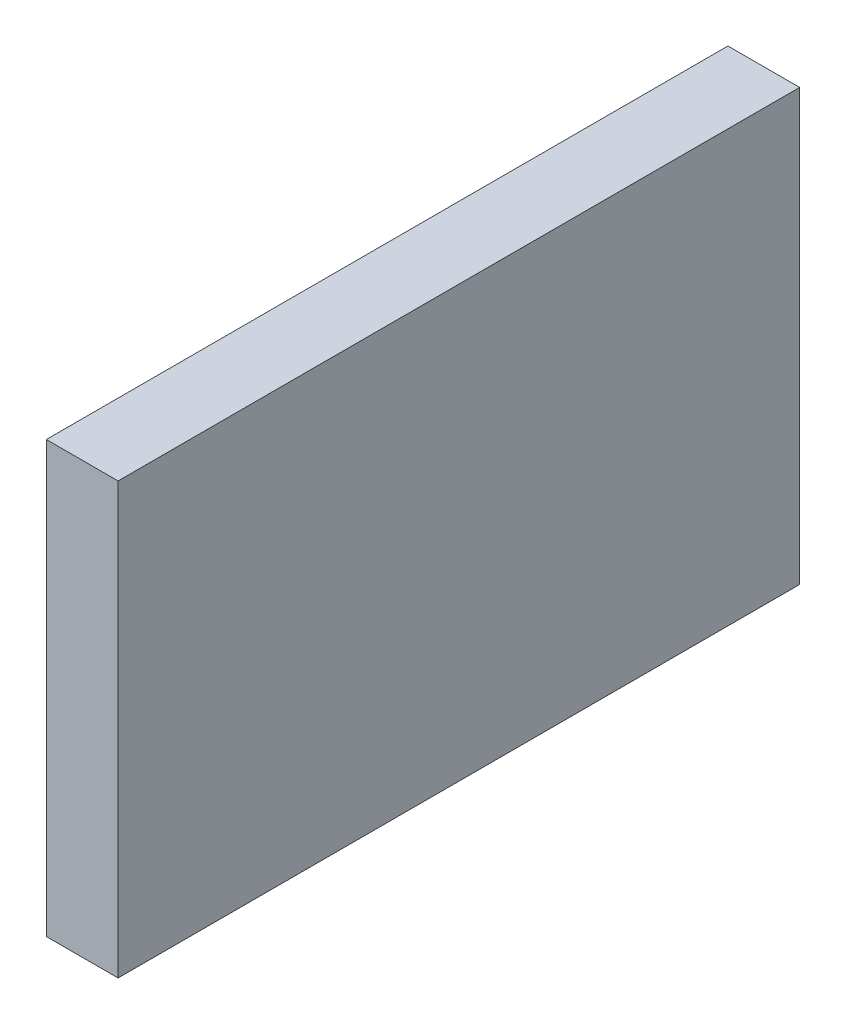
ISO-10303-21;
HEADER;
FILE_DESCRIPTION(('STEP AP214'),'2;1');
FILE_NAME('part.step','',(''),(''),'','','');
FILE_SCHEMA(('AUTOMOTIVE_DESIGN { 1 0 10303 214 1 1 1 1 }'));
ENDSEC;
DATA;
#1=APPLICATION_CONTEXT('core data for automotive mechanical design processes');
#2=APPLICATION_PROTOCOL_DEFINITION('international standard','automotive_design',2000,#1);
#3=PRODUCT_CONTEXT('',#1,'mechanical');
#4=PRODUCT('Part','Part','',(#3));
#5=PRODUCT_RELATED_PRODUCT_CATEGORY('part','',(#4));
#6=PRODUCT_DEFINITION_FORMATION('','',#4);
#7=PRODUCT_DEFINITION_CONTEXT('part definition',#1,'design');
#8=PRODUCT_DEFINITION('design','',#6,#7);
#9=PRODUCT_DEFINITION_SHAPE('','',#8);
#10=(LENGTH_UNIT() NAMED_UNIT(*) SI_UNIT(.MILLI.,.METRE.));
#11=(NAMED_UNIT(*) PLANE_ANGLE_UNIT() SI_UNIT($,.RADIAN.));
#12=(NAMED_UNIT(*) SI_UNIT($,.STERADIAN.) SOLID_ANGLE_UNIT());
#13=UNCERTAINTY_MEASURE_WITH_UNIT(LENGTH_MEASURE(1.E-05),#10,'distance_accuracy_value','');
#14=(GEOMETRIC_REPRESENTATION_CONTEXT(3) GLOBAL_UNCERTAINTY_ASSIGNED_CONTEXT((#13)) GLOBAL_UNIT_ASSIGNED_CONTEXT((#10,
#11,#12)) REPRESENTATION_CONTEXT('',''));
#15=CARTESIAN_POINT('',(0.,0.,0.));
#16=DIRECTION('',(0.,0.,1.));
#17=DIRECTION('',(1.,0.,0.));
#18=AXIS2_PLACEMENT_3D('',#15,#16,#17);
#19=CARTESIAN_POINT('',(230.,40.,190.));
#20=DIRECTION('',(-1.,0.,0.));
#21=DIRECTION('',(0.,-1.,0.));
#22=AXIS2_PLACEMENT_3D('',#19,#20,#21);
#23=PLANE('',#22);
#24=DIRECTION('',(0.,1.,0.));
#25=VECTOR('',#24,1.);
#26=CARTESIAN_POINT('',(230.,40.,0.));
#27=LINE('',#26,#25);
#28=CARTESIAN_POINT('',(230.,-80.,0.));
#29=VERTEX_POINT('',#28);
#30=CARTESIAN_POINT('',(230.,40.,0.));
#31=VERTEX_POINT('',#30);
#32=EDGE_CURVE('E96',#29,#31,#27,.T.);
#33=ORIENTED_EDGE('',*,*,#32,.T.);
#34=DIRECTION('',(0.,0.,-1.));
#35=VECTOR('',#34,1.);
#36=CARTESIAN_POINT('',(230.,40.,190.));
#37=LINE('',#36,#35);
#38=CARTESIAN_POINT('',(230.,40.,190.));
#39=VERTEX_POINT('',#38);
#40=EDGE_CURVE('E11',#39,#31,#37,.T.);
#41=ORIENTED_EDGE('',*,*,#40,.F.);
#42=DIRECTION('',(0.,1.,0.));
#43=VECTOR('',#42,1.);
#44=CARTESIAN_POINT('',(230.,40.,190.));
#45=LINE('',#44,#43);
#46=CARTESIAN_POINT('',(230.,-80.,190.));
#47=VERTEX_POINT('',#46);
#48=EDGE_CURVE('E84',#47,#39,#45,.T.);
#49=ORIENTED_EDGE('',*,*,#48,.F.);
#50=DIRECTION('',(0.,0.,-1.));
#51=VECTOR('',#50,1.);
#52=CARTESIAN_POINT('',(230.,-80.,190.));
#53=LINE('',#52,#51);
#54=EDGE_CURVE('E92',#47,#29,#53,.T.);
#55=ORIENTED_EDGE('',*,*,#54,.T.);
#56=EDGE_LOOP('',(#33,#41,#49,#55));
#57=FACE_BOUND('',#56,.T.);
#58=ADVANCED_FACE('F33',(#57),#23,.F.);
#59=CARTESIAN_POINT('',(230.,40.,190.));
#60=DIRECTION('',(0.,-1.,0.));
#61=DIRECTION('',(0.,0.,-1.));
#62=AXIS2_PLACEMENT_3D('',#59,#60,#61);
#63=PLANE('',#62);
#64=DIRECTION('',(-1.,0.,0.));
#65=VECTOR('',#64,1.);
#66=CARTESIAN_POINT('',(230.,40.,0.));
#67=LINE('',#66,#65);
#68=CARTESIAN_POINT('',(210.,40.,0.));
#69=VERTEX_POINT('',#68);
#70=EDGE_CURVE('E88',#31,#69,#67,.T.);
#71=ORIENTED_EDGE('',*,*,#70,.T.);
#72=DIRECTION('',(0.,0.,-1.));
#73=VECTOR('',#72,1.);
#74=CARTESIAN_POINT('',(210.,40.,190.));
#75=LINE('',#74,#73);
#76=CARTESIAN_POINT('',(210.,40.,190.));
#77=VERTEX_POINT('',#76);
#78=EDGE_CURVE('E41',#77,#69,#75,.T.);
#79=ORIENTED_EDGE('',*,*,#78,.F.);
#80=DIRECTION('',(-1.,0.,0.));
#81=VECTOR('',#80,1.);
#82=CARTESIAN_POINT('',(230.,40.,190.));
#83=LINE('',#82,#81);
#84=EDGE_CURVE('E79',#39,#77,#83,.T.);
#85=ORIENTED_EDGE('',*,*,#84,.F.);
#86=ORIENTED_EDGE('',*,*,#40,.T.);
#87=EDGE_LOOP('',(#71,#79,#85,#86));
#88=FACE_BOUND('',#87,.T.);
#89=ADVANCED_FACE('F87',(#88),#63,.F.);
#90=CARTESIAN_POINT('',(210.,40.,190.));
#91=DIRECTION('',(1.,0.,0.));
#92=DIRECTION('',(0.,0.,-1.));
#93=AXIS2_PLACEMENT_3D('',#90,#91,#92);
#94=PLANE('',#93);
#95=DIRECTION('',(0.,-1.,0.));
#96=VECTOR('',#95,1.);
#97=CARTESIAN_POINT('',(210.,40.,0.));
#98=LINE('',#97,#96);
#99=CARTESIAN_POINT('',(210.,-80.,0.));
#100=VERTEX_POINT('',#99);
#101=EDGE_CURVE('E66',#69,#100,#98,.T.);
#102=ORIENTED_EDGE('',*,*,#101,.T.);
#103=DIRECTION('',(0.,0.,-1.));
#104=VECTOR('',#103,1.);
#105=CARTESIAN_POINT('',(210.,-80.,190.));
#106=LINE('',#105,#104);
#107=CARTESIAN_POINT('',(210.,-80.,190.));
#108=VERTEX_POINT('',#107);
#109=EDGE_CURVE('E89',#108,#100,#106,.T.);
#110=ORIENTED_EDGE('',*,*,#109,.F.);
#111=DIRECTION('',(0.,-1.,0.));
#112=VECTOR('',#111,1.);
#113=CARTESIAN_POINT('',(210.,40.,190.));
#114=LINE('',#113,#112);
#115=EDGE_CURVE('E82',#77,#108,#114,.T.);
#116=ORIENTED_EDGE('',*,*,#115,.F.);
#117=ORIENTED_EDGE('',*,*,#78,.T.);
#118=EDGE_LOOP('',(#102,#110,#116,#117));
#119=FACE_BOUND('',#118,.T.);
#120=ADVANCED_FACE('F90',(#119),#94,.F.);
#121=CARTESIAN_POINT('',(230.,-80.,190.));
#122=DIRECTION('',(0.,1.,0.));
#123=DIRECTION('',(0.,0.,1.));
#124=AXIS2_PLACEMENT_3D('',#121,#122,#123);
#125=PLANE('',#124);
#126=DIRECTION('',(1.,0.,0.));
#127=VECTOR('',#126,1.);
#128=CARTESIAN_POINT('',(230.,-80.,0.));
#129=LINE('',#128,#127);
#130=EDGE_CURVE('E72',#100,#29,#129,.T.);
#131=ORIENTED_EDGE('',*,*,#130,.T.);
#132=ORIENTED_EDGE('',*,*,#54,.F.);
#133=DIRECTION('',(1.,0.,0.));
#134=VECTOR('',#133,1.);
#135=CARTESIAN_POINT('',(230.,-80.,190.));
#136=LINE('',#135,#134);
#137=EDGE_CURVE('E49',#108,#47,#136,.T.);
#138=ORIENTED_EDGE('',*,*,#137,.F.);
#139=ORIENTED_EDGE('',*,*,#109,.T.);
#140=EDGE_LOOP('',(#131,#132,#138,#139));
#141=FACE_BOUND('',#140,.T.);
#142=ADVANCED_FACE('F103',(#141),#125,.F.);
#143=CARTESIAN_POINT('',(0.,0.,190.));
#144=DIRECTION('',(0.,0.,-1.));
#145=DIRECTION('',(-1.,0.,0.));
#146=AXIS2_PLACEMENT_3D('',#143,#144,#145);
#147=PLANE('',#146);
#148=ORIENTED_EDGE('',*,*,#48,.T.);
#149=ORIENTED_EDGE('',*,*,#84,.T.);
#150=ORIENTED_EDGE('',*,*,#115,.T.);
#151=ORIENTED_EDGE('',*,*,#137,.T.);
#152=EDGE_LOOP('',(#148,#149,#150,#151));
#153=FACE_BOUND('',#152,.T.);
#154=ADVANCED_FACE('F80',(#153),#147,.F.);
#155=CARTESIAN_POINT('',(0.,0.,0.));
#156=DIRECTION('',(0.,0.,-1.));
#157=DIRECTION('',(-1.,0.,0.));
#158=AXIS2_PLACEMENT_3D('',#155,#156,#157);
#159=PLANE('',#158);
#160=ORIENTED_EDGE('',*,*,#32,.F.);
#161=ORIENTED_EDGE('',*,*,#130,.F.);
#162=ORIENTED_EDGE('',*,*,#101,.F.);
#163=ORIENTED_EDGE('',*,*,#70,.F.);
#164=EDGE_LOOP('',(#160,#161,#162,#163));
#165=FACE_BOUND('',#164,.T.);
#166=ADVANCED_FACE('F106',(#165),#159,.T.);
#167=CLOSED_SHELL('',(#58,#89,#120,#142,#154,#166));
#168=MANIFOLD_SOLID_BREP('B2',#167);
#169=ADVANCED_BREP_SHAPE_REPRESENTATION('',(#18,#168),#14);
#170=SHAPE_DEFINITION_REPRESENTATION(#9,#169);
ENDSEC;
END-ISO-10303-21;
